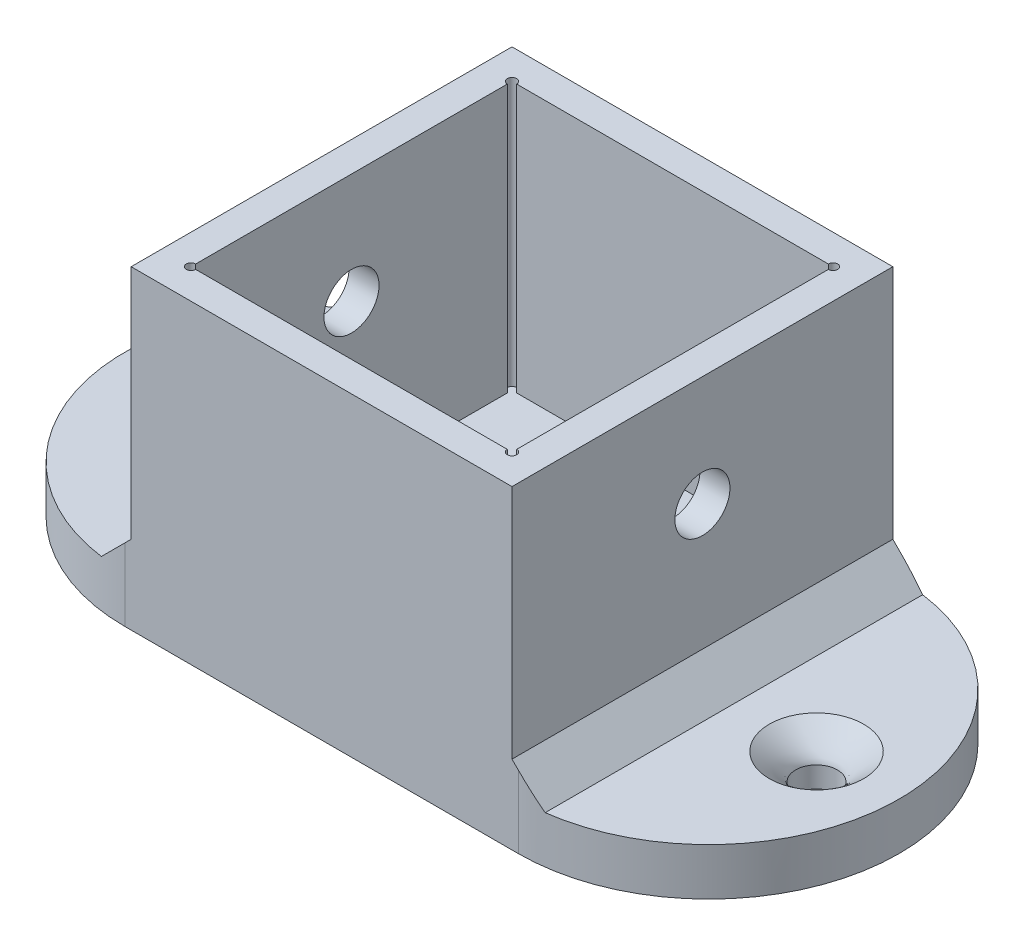
ISO-10303-21;
HEADER;
FILE_DESCRIPTION(('STEP AP214'),'2;1');
FILE_NAME('part.step','',(''),(''),'','','');
FILE_SCHEMA(('AUTOMOTIVE_DESIGN { 1 0 10303 214 1 1 1 1 }'));
ENDSEC;
DATA;
#1=APPLICATION_CONTEXT('core data for automotive mechanical design processes');
#2=APPLICATION_PROTOCOL_DEFINITION('international standard','automotive_design',2000,#1);
#3=PRODUCT_CONTEXT('',#1,'mechanical');
#4=PRODUCT('Part','Part','',(#3));
#5=PRODUCT_RELATED_PRODUCT_CATEGORY('part','',(#4));
#6=PRODUCT_DEFINITION_FORMATION('','',#4);
#7=PRODUCT_DEFINITION_CONTEXT('part definition',#1,'design');
#8=PRODUCT_DEFINITION('design','',#6,#7);
#9=PRODUCT_DEFINITION_SHAPE('','',#8);
#10=(LENGTH_UNIT() NAMED_UNIT(*) SI_UNIT(.MILLI.,.METRE.));
#11=(NAMED_UNIT(*) PLANE_ANGLE_UNIT() SI_UNIT($,.RADIAN.));
#12=(NAMED_UNIT(*) SI_UNIT($,.STERADIAN.) SOLID_ANGLE_UNIT());
#13=UNCERTAINTY_MEASURE_WITH_UNIT(LENGTH_MEASURE(1.E-05),#10,'distance_accuracy_value','');
#14=(GEOMETRIC_REPRESENTATION_CONTEXT(3) GLOBAL_UNCERTAINTY_ASSIGNED_CONTEXT((#13)) GLOBAL_UNIT_ASSIGNED_CONTEXT((#10,
#11,#12)) REPRESENTATION_CONTEXT('',''));
#15=CARTESIAN_POINT('',(0.,0.,0.));
#16=DIRECTION('',(0.,0.,1.));
#17=DIRECTION('',(1.,0.,0.));
#18=AXIS2_PLACEMENT_3D('',#15,#16,#17);
#19=CARTESIAN_POINT('',(-15.875,3.81,0.));
#20=DIRECTION('',(0.,1.,0.));
#21=DIRECTION('',(0.,0.,1.));
#22=AXIS2_PLACEMENT_3D('',#19,#20,#21);
#23=PLANE('',#22);
#24=CARTESIAN_POINT('',(24.5745,3.81,0.));
#25=DIRECTION('',(0.,-1.,0.));
#26=DIRECTION('',(0.,0.,1.));
#27=AXIS2_PLACEMENT_3D('',#24,#25,#26);
#28=CIRCLE('',#27,3.81);
#29=CARTESIAN_POINT('',(24.2111810717778,3.81,-3.79263751977373));
#30=VERTEX_POINT('',#29);
#31=EDGE_CURVE('E313',#30,#30,#28,.T.);
#32=ORIENTED_EDGE('',*,*,#31,.T.);
#33=EDGE_LOOP('',(#32));
#34=FACE_BOUND('',#33,.T.);
#35=CARTESIAN_POINT('',(15.875,3.81,0.));
#36=DIRECTION('',(0.,1.,0.));
#37=DIRECTION('',(0.,0.,1.));
#38=AXIS2_PLACEMENT_3D('',#35,#36,#37);
#39=CIRCLE('',#38,15.367);
#40=CARTESIAN_POINT('',(17.907,3.81,15.2320604318654));
#41=VERTEX_POINT('',#40);
#42=CARTESIAN_POINT('',(17.907,3.81,-15.2320604318654));
#43=VERTEX_POINT('',#42);
#44=EDGE_CURVE('E222',#41,#43,#39,.T.);
#45=ORIENTED_EDGE('',*,*,#44,.T.);
#46=DIRECTION('',(0.,0.,1.));
#47=VECTOR('',#46,1.);
#48=CARTESIAN_POINT('',(17.907,3.81,0.));
#49=LINE('',#48,#47);
#50=EDGE_CURVE('E248',#43,#41,#49,.T.);
#51=ORIENTED_EDGE('',*,*,#50,.T.);
#52=EDGE_LOOP('',(#45,#51));
#53=FACE_BOUND('',#52,.T.);
#54=ADVANCED_FACE('F37',(#34,#53),#23,.T.);
#55=CARTESIAN_POINT('',(-15.875,3.81,0.));
#56=DIRECTION('',(0.,-1.,0.));
#57=DIRECTION('',(0.,0.,-1.));
#58=AXIS2_PLACEMENT_3D('',#55,#56,#57);
#59=CYLINDRICAL_SURFACE('',#58,15.367);
#60=CARTESIAN_POINT('',(-15.875,0.,0.));
#61=DIRECTION('',(0.,1.,0.));
#62=DIRECTION('',(0.,0.,1.));
#63=AXIS2_PLACEMENT_3D('',#60,#61,#62);
#64=CIRCLE('',#63,15.367);
#65=CARTESIAN_POINT('',(-15.875,0.,-15.367));
#66=VERTEX_POINT('',#65);
#67=CARTESIAN_POINT('',(-15.875,0.,15.367));
#68=VERTEX_POINT('',#67);
#69=EDGE_CURVE('E218',#66,#68,#64,.T.);
#70=ORIENTED_EDGE('',*,*,#69,.T.);
#71=DIRECTION('',(0.,-1.,0.));
#72=VECTOR('',#71,1.);
#73=CARTESIAN_POINT('',(-15.875,3.81,15.367));
#74=LINE('',#73,#72);
#75=CARTESIAN_POINT('',(-15.875,5.84200000000002,15.367));
#76=VERTEX_POINT('',#75);
#77=EDGE_CURVE('E242',#76,#68,#74,.T.);
#78=ORIENTED_EDGE('',*,*,#77,.F.);
#79=CARTESIAN_POINT('',(-15.875,5.84200000000002,0.));
#80=DIRECTION('',(0.707106781186552,-0.707106781186543,0.));
#81=DIRECTION('',(-0.707106781186543,-0.707106781186552,0.));
#82=AXIS2_PLACEMENT_3D('',#79,#80,#81);
#83=ELLIPSE('',#82,21.7322198129875,15.367);
#84=CARTESIAN_POINT('',(-17.907,3.81,15.2320604318654));
#85=VERTEX_POINT('',#84);
#86=EDGE_CURVE('E268',#76,#85,#83,.T.);
#87=ORIENTED_EDGE('',*,*,#86,.T.);
#88=CARTESIAN_POINT('',(-15.875,3.81,0.));
#89=DIRECTION('',(0.,1.,0.));
#90=DIRECTION('',(0.,0.,1.));
#91=AXIS2_PLACEMENT_3D('',#88,#89,#90);
#92=CIRCLE('',#91,15.367);
#93=CARTESIAN_POINT('',(-17.907,3.81,-15.2320604318654));
#94=VERTEX_POINT('',#93);
#95=EDGE_CURVE('E219',#94,#85,#92,.T.);
#96=ORIENTED_EDGE('',*,*,#95,.F.);
#97=CARTESIAN_POINT('',(-15.875,5.84200000000002,0.));
#98=DIRECTION('',(0.707106781186552,-0.707106781186543,0.));
#99=DIRECTION('',(-0.707106781186543,-0.707106781186552,0.));
#100=AXIS2_PLACEMENT_3D('',#97,#98,#99);
#101=ELLIPSE('',#100,21.7322198129875,15.367);
#102=CARTESIAN_POINT('',(-15.875,5.84200000000002,-15.367));
#103=VERTEX_POINT('',#102);
#104=EDGE_CURVE('E46',#94,#103,#101,.T.);
#105=ORIENTED_EDGE('',*,*,#104,.T.);
#106=DIRECTION('',(0.,-1.,0.));
#107=VECTOR('',#106,1.);
#108=CARTESIAN_POINT('',(-15.875,3.81,-15.367));
#109=LINE('',#108,#107);
#110=EDGE_CURVE('E226',#103,#66,#109,.T.);
#111=ORIENTED_EDGE('',*,*,#110,.T.);
#112=EDGE_LOOP('',(#70,#78,#87,#96,#105,#111));
#113=FACE_BOUND('',#112,.T.);
#114=ADVANCED_FACE('F393',(#113),#59,.T.);
#115=CARTESIAN_POINT('',(-15.875,3.81,15.367));
#116=DIRECTION('',(0.,0.,-1.));
#117=DIRECTION('',(-1.,0.,0.));
#118=AXIS2_PLACEMENT_3D('',#115,#116,#117);
#119=PLANE('',#118);
#120=DIRECTION('',(1.,0.,0.));
#121=VECTOR('',#120,1.);
#122=CARTESIAN_POINT('',(-15.875,0.,15.367));
#123=LINE('',#122,#121);
#124=CARTESIAN_POINT('',(15.875,0.,15.367));
#125=VERTEX_POINT('',#124);
#126=EDGE_CURVE('E229',#68,#125,#123,.T.);
#127=ORIENTED_EDGE('',*,*,#126,.T.);
#128=DIRECTION('',(0.,-1.,0.));
#129=VECTOR('',#128,1.);
#130=CARTESIAN_POINT('',(15.875,3.81,15.367));
#131=LINE('',#130,#129);
#132=CARTESIAN_POINT('',(15.875,5.84200000000001,15.367));
#133=VERTEX_POINT('',#132);
#134=EDGE_CURVE('E239',#133,#125,#131,.T.);
#135=ORIENTED_EDGE('',*,*,#134,.F.);
#136=DIRECTION('',(-0.707106781186543,0.707106781186552,0.));
#137=VECTOR('',#136,1.);
#138=CARTESIAN_POINT('',(1.01600000000019,20.701,15.367));
#139=LINE('',#138,#137);
#140=CARTESIAN_POINT('',(15.367,6.35000000000002,15.367));
#141=VERTEX_POINT('',#140);
#142=EDGE_CURVE('E263',#133,#141,#139,.T.);
#143=ORIENTED_EDGE('',*,*,#142,.T.);
#144=DIRECTION('',(0.,-1.,0.));
#145=VECTOR('',#144,1.);
#146=CARTESIAN_POINT('',(15.367,25.4,15.367));
#147=LINE('',#146,#145);
#148=CARTESIAN_POINT('',(15.367,25.4,15.367));
#149=VERTEX_POINT('',#148);
#150=EDGE_CURVE('E206',#149,#141,#147,.T.);
#151=ORIENTED_EDGE('',*,*,#150,.F.);
#152=DIRECTION('',(1.,0.,0.));
#153=VECTOR('',#152,1.);
#154=CARTESIAN_POINT('',(-15.367,25.4,15.367));
#155=LINE('',#154,#153);
#156=CARTESIAN_POINT('',(-15.367,25.4,15.367));
#157=VERTEX_POINT('',#156);
#158=EDGE_CURVE('E204',#157,#149,#155,.T.);
#159=ORIENTED_EDGE('',*,*,#158,.F.);
#160=DIRECTION('',(0.,-1.,0.));
#161=VECTOR('',#160,1.);
#162=CARTESIAN_POINT('',(-15.367,25.4,15.367));
#163=LINE('',#162,#161);
#164=CARTESIAN_POINT('',(-15.367,6.35000000000002,15.367));
#165=VERTEX_POINT('',#164);
#166=EDGE_CURVE('E209',#157,#165,#163,.T.);
#167=ORIENTED_EDGE('',*,*,#166,.T.);
#168=DIRECTION('',(-0.707106781186543,-0.707106781186552,0.));
#169=VECTOR('',#168,1.);
#170=CARTESIAN_POINT('',(-16.891,4.826,15.367));
#171=LINE('',#170,#169);
#172=EDGE_CURVE('E265',#165,#76,#171,.T.);
#173=ORIENTED_EDGE('',*,*,#172,.T.);
#174=ORIENTED_EDGE('',*,*,#77,.T.);
#175=EDGE_LOOP('',(#127,#135,#143,#151,#159,#167,#173,#174));
#176=FACE_BOUND('',#175,.T.);
#177=ADVANCED_FACE('F397',(#176),#119,.F.);
#178=CARTESIAN_POINT('',(15.875,3.81,0.));
#179=DIRECTION('',(0.,-1.,0.));
#180=DIRECTION('',(0.,0.,-1.));
#181=AXIS2_PLACEMENT_3D('',#178,#179,#180);
#182=CYLINDRICAL_SURFACE('',#181,15.367);
#183=CARTESIAN_POINT('',(15.875,0.,0.));
#184=DIRECTION('',(0.,1.,0.));
#185=DIRECTION('',(0.,0.,1.));
#186=AXIS2_PLACEMENT_3D('',#183,#184,#185);
#187=CIRCLE('',#186,15.367);
#188=CARTESIAN_POINT('',(15.875,0.,-15.367));
#189=VERTEX_POINT('',#188);
#190=EDGE_CURVE('E231',#125,#189,#187,.T.);
#191=ORIENTED_EDGE('',*,*,#190,.T.);
#192=DIRECTION('',(0.,-1.,0.));
#193=VECTOR('',#192,1.);
#194=CARTESIAN_POINT('',(15.875,3.81,-15.367));
#195=LINE('',#194,#193);
#196=CARTESIAN_POINT('',(15.875,5.84200000000002,-15.367));
#197=VERTEX_POINT('',#196);
#198=EDGE_CURVE('E236',#197,#189,#195,.T.);
#199=ORIENTED_EDGE('',*,*,#198,.F.);
#200=CARTESIAN_POINT('',(15.875,5.84200000000001,0.));
#201=DIRECTION('',(-0.707106781186552,-0.707106781186543,0.));
#202=DIRECTION('',(0.707106781186543,-0.707106781186552,0.));
#203=AXIS2_PLACEMENT_3D('',#200,#201,#202);
#204=ELLIPSE('',#203,21.7322198129875,15.367);
#205=EDGE_CURVE('E258',#197,#43,#204,.T.);
#206=ORIENTED_EDGE('',*,*,#205,.T.);
#207=ORIENTED_EDGE('',*,*,#44,.F.);
#208=CARTESIAN_POINT('',(15.875,5.84200000000001,0.));
#209=DIRECTION('',(-0.707106781186552,-0.707106781186543,0.));
#210=DIRECTION('',(0.707106781186543,-0.707106781186552,0.));
#211=AXIS2_PLACEMENT_3D('',#208,#209,#210);
#212=ELLIPSE('',#211,21.7322198129875,15.367);
#213=EDGE_CURVE('E260',#41,#133,#212,.T.);
#214=ORIENTED_EDGE('',*,*,#213,.T.);
#215=ORIENTED_EDGE('',*,*,#134,.T.);
#216=EDGE_LOOP('',(#191,#199,#206,#207,#214,#215));
#217=FACE_BOUND('',#216,.T.);
#218=ADVANCED_FACE('F414',(#217),#182,.T.);
#219=CARTESIAN_POINT('',(-15.875,3.81,-15.367));
#220=DIRECTION('',(0.,0.,1.));
#221=DIRECTION('',(1.,0.,0.));
#222=AXIS2_PLACEMENT_3D('',#219,#220,#221);
#223=PLANE('',#222);
#224=DIRECTION('',(-1.,0.,0.));
#225=VECTOR('',#224,1.);
#226=CARTESIAN_POINT('',(-15.875,0.,-15.367));
#227=LINE('',#226,#225);
#228=EDGE_CURVE('E223',#189,#66,#227,.T.);
#229=ORIENTED_EDGE('',*,*,#228,.T.);
#230=ORIENTED_EDGE('',*,*,#110,.F.);
#231=DIRECTION('',(0.707106781186543,0.707106781186552,0.));
#232=VECTOR('',#231,1.);
#233=CARTESIAN_POINT('',(-16.891,4.826,-15.367));
#234=LINE('',#233,#232);
#235=CARTESIAN_POINT('',(-15.367,6.35000000000002,-15.367));
#236=VERTEX_POINT('',#235);
#237=EDGE_CURVE('E12',#103,#236,#234,.T.);
#238=ORIENTED_EDGE('',*,*,#237,.T.);
#239=DIRECTION('',(0.,-1.,0.));
#240=VECTOR('',#239,1.);
#241=CARTESIAN_POINT('',(-15.367,25.4,-15.367));
#242=LINE('',#241,#240);
#243=CARTESIAN_POINT('',(-15.367,25.4,-15.367));
#244=VERTEX_POINT('',#243);
#245=EDGE_CURVE('E212',#244,#236,#242,.T.);
#246=ORIENTED_EDGE('',*,*,#245,.F.);
#247=DIRECTION('',(-1.,0.,0.));
#248=VECTOR('',#247,1.);
#249=CARTESIAN_POINT('',(-15.367,25.4,-15.367));
#250=LINE('',#249,#248);
#251=CARTESIAN_POINT('',(15.367,25.4,-15.367));
#252=VERTEX_POINT('',#251);
#253=EDGE_CURVE('E199',#252,#244,#250,.T.);
#254=ORIENTED_EDGE('',*,*,#253,.F.);
#255=DIRECTION('',(0.,-1.,0.));
#256=VECTOR('',#255,1.);
#257=CARTESIAN_POINT('',(15.367,25.4,-15.367));
#258=LINE('',#257,#256);
#259=CARTESIAN_POINT('',(15.367,6.35000000000002,-15.367));
#260=VERTEX_POINT('',#259);
#261=EDGE_CURVE('E215',#252,#260,#258,.T.);
#262=ORIENTED_EDGE('',*,*,#261,.T.);
#263=DIRECTION('',(0.707106781186543,-0.707106781186552,0.));
#264=VECTOR('',#263,1.);
#265=CARTESIAN_POINT('',(1.01600000000019,20.701,-15.367));
#266=LINE('',#265,#264);
#267=EDGE_CURVE('E255',#260,#197,#266,.T.);
#268=ORIENTED_EDGE('',*,*,#267,.T.);
#269=ORIENTED_EDGE('',*,*,#198,.T.);
#270=EDGE_LOOP('',(#229,#230,#238,#246,#254,#262,#268,#269));
#271=FACE_BOUND('',#270,.T.);
#272=ADVANCED_FACE('F298',(#271),#223,.F.);
#273=CARTESIAN_POINT('',(-24.5745,3.81,0.));
#274=DIRECTION('',(0.,1.,0.));
#275=DIRECTION('',(0.,0.,1.));
#276=AXIS2_PLACEMENT_3D('',#273,#274,#275);
#277=CIRCLE('',#276,3.81);
#278=CARTESIAN_POINT('',(-24.2111810717778,3.81,-3.79263751977373));
#279=VERTEX_POINT('',#278);
#280=EDGE_CURVE('E276',#279,#279,#277,.T.);
#281=ORIENTED_EDGE('',*,*,#280,.F.);
#282=EDGE_LOOP('',(#281));
#283=FACE_BOUND('',#282,.T.);
#284=ORIENTED_EDGE('',*,*,#95,.T.);
#285=DIRECTION('',(0.,0.,-1.));
#286=VECTOR('',#285,1.);
#287=CARTESIAN_POINT('',(-17.907,3.81,0.));
#288=LINE('',#287,#286);
#289=EDGE_CURVE('E253',#85,#94,#288,.T.);
#290=ORIENTED_EDGE('',*,*,#289,.T.);
#291=EDGE_LOOP('',(#284,#290));
#292=FACE_BOUND('',#291,.T.);
#293=ADVANCED_FACE('F287',(#283,#292),#23,.T.);
#294=CARTESIAN_POINT('',(-15.875,0.,0.));
#295=DIRECTION('',(0.,1.,0.));
#296=DIRECTION('',(0.,0.,1.));
#297=AXIS2_PLACEMENT_3D('',#294,#295,#296);
#298=PLANE('',#297);
#299=CARTESIAN_POINT('',(24.5745,0.,0.));
#300=DIRECTION('',(0.,1.,0.));
#301=DIRECTION('',(0.,0.,1.));
#302=AXIS2_PLACEMENT_3D('',#299,#300,#301);
#303=CIRCLE('',#302,1.68274999999999);
#304=CARTESIAN_POINT('',(24.5745,0.,1.68274999999999));
#305=VERTEX_POINT('',#304);
#306=EDGE_CURVE('E275',#305,#305,#303,.F.);
#307=ORIENTED_EDGE('',*,*,#306,.F.);
#308=EDGE_LOOP('',(#307));
#309=FACE_BOUND('',#308,.T.);
#310=CARTESIAN_POINT('',(-24.5745,0.,0.));
#311=DIRECTION('',(0.,1.,0.));
#312=DIRECTION('',(0.,0.,1.));
#313=AXIS2_PLACEMENT_3D('',#310,#311,#312);
#314=CIRCLE('',#313,1.68275);
#315=CARTESIAN_POINT('',(-24.5745,0.,1.68275));
#316=VERTEX_POINT('',#315);
#317=EDGE_CURVE('E464',#316,#316,#314,.F.);
#318=ORIENTED_EDGE('',*,*,#317,.F.);
#319=EDGE_LOOP('',(#318));
#320=FACE_BOUND('',#319,.T.);
#321=ORIENTED_EDGE('',*,*,#69,.F.);
#322=ORIENTED_EDGE('',*,*,#228,.F.);
#323=ORIENTED_EDGE('',*,*,#190,.F.);
#324=ORIENTED_EDGE('',*,*,#126,.F.);
#325=EDGE_LOOP('',(#321,#322,#323,#324));
#326=FACE_BOUND('',#325,.T.);
#327=ADVANCED_FACE('F297',(#309,#320,#326),#298,.F.);
#328=CARTESIAN_POINT('',(0.,25.4,0.));
#329=DIRECTION('',(0.,-1.,0.));
#330=DIRECTION('',(0.,0.,-1.));
#331=AXIS2_PLACEMENT_3D('',#328,#329,#330);
#332=PLANE('',#331);
#333=DIRECTION('',(0.,0.,-1.));
#334=VECTOR('',#333,1.);
#335=CARTESIAN_POINT('',(15.367,25.4,15.367));
#336=LINE('',#335,#334);
#337=EDGE_CURVE('E196',#149,#252,#336,.T.);
#338=ORIENTED_EDGE('',*,*,#337,.T.);
#339=ORIENTED_EDGE('',*,*,#253,.T.);
#340=DIRECTION('',(0.,0.,1.));
#341=VECTOR('',#340,1.);
#342=CARTESIAN_POINT('',(-15.367,25.4,15.367));
#343=LINE('',#342,#341);
#344=EDGE_CURVE('E202',#244,#157,#343,.T.);
#345=ORIENTED_EDGE('',*,*,#344,.T.);
#346=ORIENTED_EDGE('',*,*,#158,.T.);
#347=EDGE_LOOP('',(#338,#339,#345,#346));
#348=FACE_BOUND('',#347,.T.);
#349=DIRECTION('',(-1.,0.,0.));
#350=VECTOR('',#349,1.);
#351=CARTESIAN_POINT('',(-12.954,25.4,-12.954));
#352=LINE('',#351,#350);
#353=CARTESIAN_POINT('',(12.573,25.4,-12.954));
#354=VERTEX_POINT('',#353);
#355=CARTESIAN_POINT('',(-12.573,25.4,-12.954));
#356=VERTEX_POINT('',#355);
#357=EDGE_CURVE('E450',#354,#356,#352,.T.);
#358=ORIENTED_EDGE('',*,*,#357,.F.);
#359=CARTESIAN_POINT('',(12.954,25.4,-12.954));
#360=DIRECTION('',(0.,1.,0.));
#361=DIRECTION('',(0.,0.,1.));
#362=AXIS2_PLACEMENT_3D('',#359,#360,#361);
#363=CIRCLE('',#362,0.381);
#364=CARTESIAN_POINT('',(12.954,25.4,-12.573));
#365=VERTEX_POINT('',#364);
#366=EDGE_CURVE('E452',#365,#354,#363,.T.);
#367=ORIENTED_EDGE('',*,*,#366,.F.);
#368=DIRECTION('',(0.,0.,-1.));
#369=VECTOR('',#368,1.);
#370=CARTESIAN_POINT('',(12.954,25.4,12.954));
#371=LINE('',#370,#369);
#372=CARTESIAN_POINT('',(12.954,25.4,12.573));
#373=VERTEX_POINT('',#372);
#374=EDGE_CURVE('E190',#373,#365,#371,.T.);
#375=ORIENTED_EDGE('',*,*,#374,.F.);
#376=CARTESIAN_POINT('',(12.954,25.4,12.954));
#377=DIRECTION('',(0.,1.,0.));
#378=DIRECTION('',(0.,0.,1.));
#379=AXIS2_PLACEMENT_3D('',#376,#377,#378);
#380=CIRCLE('',#379,0.381);
#381=CARTESIAN_POINT('',(12.573,25.4,12.954));
#382=VERTEX_POINT('',#381);
#383=EDGE_CURVE('E168',#382,#373,#380,.T.);
#384=ORIENTED_EDGE('',*,*,#383,.F.);
#385=DIRECTION('',(1.,0.,0.));
#386=VECTOR('',#385,1.);
#387=CARTESIAN_POINT('',(-12.954,25.4,12.954));
#388=LINE('',#387,#386);
#389=CARTESIAN_POINT('',(-12.573,25.4,12.954));
#390=VERTEX_POINT('',#389);
#391=EDGE_CURVE('E200',#390,#382,#388,.T.);
#392=ORIENTED_EDGE('',*,*,#391,.F.);
#393=CARTESIAN_POINT('',(-12.954,25.4,12.954));
#394=DIRECTION('',(0.,1.,0.));
#395=DIRECTION('',(0.,0.,1.));
#396=AXIS2_PLACEMENT_3D('',#393,#394,#395);
#397=CIRCLE('',#396,0.381);
#398=CARTESIAN_POINT('',(-12.954,25.4,12.573));
#399=VERTEX_POINT('',#398);
#400=EDGE_CURVE('E169',#399,#390,#397,.T.);
#401=ORIENTED_EDGE('',*,*,#400,.F.);
#402=DIRECTION('',(0.,0.,1.));
#403=VECTOR('',#402,1.);
#404=CARTESIAN_POINT('',(-12.954,25.4,12.954));
#405=LINE('',#404,#403);
#406=CARTESIAN_POINT('',(-12.954,25.4,-12.573));
#407=VERTEX_POINT('',#406);
#408=EDGE_CURVE('E179',#407,#399,#405,.T.);
#409=ORIENTED_EDGE('',*,*,#408,.F.);
#410=CARTESIAN_POINT('',(-12.954,25.4,-12.954));
#411=DIRECTION('',(0.,1.,0.));
#412=DIRECTION('',(0.,0.,1.));
#413=AXIS2_PLACEMENT_3D('',#410,#411,#412);
#414=CIRCLE('',#413,0.381);
#415=EDGE_CURVE('E454',#356,#407,#414,.T.);
#416=ORIENTED_EDGE('',*,*,#415,.F.);
#417=EDGE_LOOP('',(#358,#367,#375,#384,#392,#401,#409,#416));
#418=FACE_BOUND('',#417,.T.);
#419=ADVANCED_FACE('F381',(#348,#418),#332,.F.);
#420=CARTESIAN_POINT('',(15.367,25.4,15.367));
#421=DIRECTION('',(-1.,0.,0.));
#422=DIRECTION('',(0.,0.,1.));
#423=AXIS2_PLACEMENT_3D('',#420,#421,#422);
#424=PLANE('',#423);
#425=CARTESIAN_POINT('',(15.367,16.51,0.));
#426=DIRECTION('',(-1.,0.,0.));
#427=DIRECTION('',(0.,0.,1.));
#428=AXIS2_PLACEMENT_3D('',#425,#426,#427);
#429=CIRCLE('',#428,2.2225);
#430=CARTESIAN_POINT('',(15.367,16.51,2.2225));
#431=VERTEX_POINT('',#430);
#432=EDGE_CURVE('E317',#431,#431,#429,.T.);
#433=ORIENTED_EDGE('',*,*,#432,.T.);
#434=EDGE_LOOP('',(#433));
#435=FACE_BOUND('',#434,.T.);
#436=ORIENTED_EDGE('',*,*,#150,.T.);
#437=DIRECTION('',(0.,0.,-1.));
#438=VECTOR('',#437,1.);
#439=CARTESIAN_POINT('',(15.367,6.35000000000002,15.367));
#440=LINE('',#439,#438);
#441=EDGE_CURVE('E245',#141,#260,#440,.T.);
#442=ORIENTED_EDGE('',*,*,#441,.T.);
#443=ORIENTED_EDGE('',*,*,#261,.F.);
#444=ORIENTED_EDGE('',*,*,#337,.F.);
#445=EDGE_LOOP('',(#436,#442,#443,#444));
#446=FACE_BOUND('',#445,.T.);
#447=ADVANCED_FACE('F299',(#435,#446),#424,.F.);
#448=CARTESIAN_POINT('',(-15.367,25.4,15.367));
#449=DIRECTION('',(1.,0.,0.));
#450=DIRECTION('',(0.,0.,-1.));
#451=AXIS2_PLACEMENT_3D('',#448,#449,#450);
#452=PLANE('',#451);
#453=CARTESIAN_POINT('',(-15.367,16.51,0.));
#454=DIRECTION('',(1.,0.,0.));
#455=DIRECTION('',(0.,0.,-1.));
#456=AXIS2_PLACEMENT_3D('',#453,#454,#455);
#457=CIRCLE('',#456,2.2225);
#458=CARTESIAN_POINT('',(-15.367,16.51,-2.2225));
#459=VERTEX_POINT('',#458);
#460=EDGE_CURVE('E321',#459,#459,#457,.T.);
#461=ORIENTED_EDGE('',*,*,#460,.T.);
#462=EDGE_LOOP('',(#461));
#463=FACE_BOUND('',#462,.T.);
#464=ORIENTED_EDGE('',*,*,#245,.T.);
#465=DIRECTION('',(0.,0.,1.));
#466=VECTOR('',#465,1.);
#467=CARTESIAN_POINT('',(-15.367,6.35000000000002,15.367));
#468=LINE('',#467,#466);
#469=EDGE_CURVE('E250',#236,#165,#468,.T.);
#470=ORIENTED_EDGE('',*,*,#469,.T.);
#471=ORIENTED_EDGE('',*,*,#166,.F.);
#472=ORIENTED_EDGE('',*,*,#344,.F.);
#473=EDGE_LOOP('',(#464,#470,#471,#472));
#474=FACE_BOUND('',#473,.T.);
#475=ADVANCED_FACE('F379',(#463,#474),#452,.F.);
#476=CARTESIAN_POINT('',(12.954,25.4,12.954));
#477=DIRECTION('',(-1.,0.,0.));
#478=DIRECTION('',(0.,0.,1.));
#479=AXIS2_PLACEMENT_3D('',#476,#477,#478);
#480=PLANE('',#479);
#481=DIRECTION('',(0.,1.,0.));
#482=VECTOR('',#481,1.);
#483=CARTESIAN_POINT('',(12.954,2.73236926547171,-12.573));
#484=LINE('',#483,#482);
#485=CARTESIAN_POINT('',(12.954,3.81,-12.573));
#486=VERTEX_POINT('',#485);
#487=EDGE_CURVE('E661',#486,#365,#484,.T.);
#488=ORIENTED_EDGE('',*,*,#487,.F.);
#489=DIRECTION('',(0.,0.,-1.));
#490=VECTOR('',#489,1.);
#491=CARTESIAN_POINT('',(12.954,3.81,12.954));
#492=LINE('',#491,#490);
#493=CARTESIAN_POINT('',(12.954,3.81,12.573));
#494=VERTEX_POINT('',#493);
#495=EDGE_CURVE('E192',#494,#486,#492,.T.);
#496=ORIENTED_EDGE('',*,*,#495,.F.);
#497=DIRECTION('',(0.,1.,0.));
#498=VECTOR('',#497,1.);
#499=CARTESIAN_POINT('',(12.954,2.73236926547171,12.573));
#500=LINE('',#499,#498);
#501=EDGE_CURVE('E665',#373,#494,#500,.F.);
#502=ORIENTED_EDGE('',*,*,#501,.F.);
#503=ORIENTED_EDGE('',*,*,#374,.T.);
#504=EDGE_LOOP('',(#488,#496,#502,#503));
#505=FACE_BOUND('',#504,.T.);
#506=CARTESIAN_POINT('',(12.954,16.51,0.));
#507=DIRECTION('',(-1.,0.,0.));
#508=DIRECTION('',(0.,0.,1.));
#509=AXIS2_PLACEMENT_3D('',#506,#507,#508);
#510=CIRCLE('',#509,2.2225);
#511=CARTESIAN_POINT('',(12.954,16.51,2.2225));
#512=VERTEX_POINT('',#511);
#513=EDGE_CURVE('E674',#512,#512,#510,.T.);
#514=ORIENTED_EDGE('',*,*,#513,.F.);
#515=EDGE_LOOP('',(#514));
#516=FACE_BOUND('',#515,.T.);
#517=ADVANCED_FACE('F375',(#505,#516),#480,.T.);
#518=CARTESIAN_POINT('',(-12.954,25.4,-12.954));
#519=DIRECTION('',(0.,0.,1.));
#520=DIRECTION('',(1.,0.,0.));
#521=AXIS2_PLACEMENT_3D('',#518,#519,#520);
#522=PLANE('',#521);
#523=DIRECTION('',(0.,1.,0.));
#524=VECTOR('',#523,1.);
#525=CARTESIAN_POINT('',(12.573,2.73236926547171,-12.954));
#526=LINE('',#525,#524);
#527=CARTESIAN_POINT('',(12.573,3.81,-12.954));
#528=VERTEX_POINT('',#527);
#529=EDGE_CURVE('E662',#354,#528,#526,.F.);
#530=ORIENTED_EDGE('',*,*,#529,.F.);
#531=ORIENTED_EDGE('',*,*,#357,.T.);
#532=DIRECTION('',(0.,1.,0.));
#533=VECTOR('',#532,1.);
#534=CARTESIAN_POINT('',(-12.573,2.73236926547171,-12.954));
#535=LINE('',#534,#533);
#536=CARTESIAN_POINT('',(-12.573,3.81,-12.954));
#537=VERTEX_POINT('',#536);
#538=EDGE_CURVE('E672',#537,#356,#535,.T.);
#539=ORIENTED_EDGE('',*,*,#538,.F.);
#540=DIRECTION('',(-1.,0.,0.));
#541=VECTOR('',#540,1.);
#542=CARTESIAN_POINT('',(-12.954,3.81,-12.954));
#543=LINE('',#542,#541);
#544=EDGE_CURVE('E188',#528,#537,#543,.T.);
#545=ORIENTED_EDGE('',*,*,#544,.F.);
#546=EDGE_LOOP('',(#530,#531,#539,#545));
#547=FACE_BOUND('',#546,.T.);
#548=ADVANCED_FACE('F372',(#547),#522,.T.);
#549=CARTESIAN_POINT('',(-12.954,25.4,12.954));
#550=DIRECTION('',(1.,0.,0.));
#551=DIRECTION('',(0.,0.,-1.));
#552=AXIS2_PLACEMENT_3D('',#549,#550,#551);
#553=PLANE('',#552);
#554=DIRECTION('',(0.,1.,0.));
#555=VECTOR('',#554,1.);
#556=CARTESIAN_POINT('',(-12.954,2.73236926547171,12.573));
#557=LINE('',#556,#555);
#558=CARTESIAN_POINT('',(-12.954,3.81,12.573));
#559=VERTEX_POINT('',#558);
#560=EDGE_CURVE('E163',#559,#399,#557,.T.);
#561=ORIENTED_EDGE('',*,*,#560,.F.);
#562=DIRECTION('',(0.,0.,1.));
#563=VECTOR('',#562,1.);
#564=CARTESIAN_POINT('',(-12.954,3.81,12.954));
#565=LINE('',#564,#563);
#566=CARTESIAN_POINT('',(-12.954,3.81,-12.573));
#567=VERTEX_POINT('',#566);
#568=EDGE_CURVE('E177',#567,#559,#565,.T.);
#569=ORIENTED_EDGE('',*,*,#568,.F.);
#570=DIRECTION('',(0.,1.,0.));
#571=VECTOR('',#570,1.);
#572=CARTESIAN_POINT('',(-12.954,2.73236926547171,-12.573));
#573=LINE('',#572,#571);
#574=EDGE_CURVE('E670',#407,#567,#573,.F.);
#575=ORIENTED_EDGE('',*,*,#574,.F.);
#576=ORIENTED_EDGE('',*,*,#408,.T.);
#577=EDGE_LOOP('',(#561,#569,#575,#576));
#578=FACE_BOUND('',#577,.T.);
#579=CARTESIAN_POINT('',(-12.954,16.51,0.));
#580=DIRECTION('',(1.,0.,0.));
#581=DIRECTION('',(0.,0.,-1.));
#582=AXIS2_PLACEMENT_3D('',#579,#580,#581);
#583=CIRCLE('',#582,2.2225);
#584=CARTESIAN_POINT('',(-12.954,16.51,-2.2225));
#585=VERTEX_POINT('',#584);
#586=EDGE_CURVE('E41',#585,#585,#583,.T.);
#587=ORIENTED_EDGE('',*,*,#586,.F.);
#588=EDGE_LOOP('',(#587));
#589=FACE_BOUND('',#588,.T.);
#590=ADVANCED_FACE('F174',(#578,#589),#553,.T.);
#591=CARTESIAN_POINT('',(-12.954,25.4,12.954));
#592=DIRECTION('',(0.,0.,-1.));
#593=DIRECTION('',(-1.,0.,0.));
#594=AXIS2_PLACEMENT_3D('',#591,#592,#593);
#595=PLANE('',#594);
#596=DIRECTION('',(0.,1.,0.));
#597=VECTOR('',#596,1.);
#598=CARTESIAN_POINT('',(12.573,2.73236926547171,12.954));
#599=LINE('',#598,#597);
#600=CARTESIAN_POINT('',(12.573,3.81,12.954));
#601=VERTEX_POINT('',#600);
#602=EDGE_CURVE('E180',#601,#382,#599,.T.);
#603=ORIENTED_EDGE('',*,*,#602,.F.);
#604=DIRECTION('',(1.,0.,0.));
#605=VECTOR('',#604,1.);
#606=CARTESIAN_POINT('',(-12.954,3.81,12.954));
#607=LINE('',#606,#605);
#608=CARTESIAN_POINT('',(-12.573,3.81,12.954));
#609=VERTEX_POINT('',#608);
#610=EDGE_CURVE('E187',#609,#601,#607,.T.);
#611=ORIENTED_EDGE('',*,*,#610,.F.);
#612=DIRECTION('',(0.,1.,0.));
#613=VECTOR('',#612,1.);
#614=CARTESIAN_POINT('',(-12.573,2.73236926547171,12.954));
#615=LINE('',#614,#613);
#616=EDGE_CURVE('E166',#390,#609,#615,.F.);
#617=ORIENTED_EDGE('',*,*,#616,.F.);
#618=ORIENTED_EDGE('',*,*,#391,.T.);
#619=EDGE_LOOP('',(#603,#611,#617,#618));
#620=FACE_BOUND('',#619,.T.);
#621=ADVANCED_FACE('F366',(#620),#595,.T.);
#622=CARTESIAN_POINT('',(12.954,3.81,12.954));
#623=DIRECTION('',(0.,1.,0.));
#624=DIRECTION('',(0.,0.,1.));
#625=AXIS2_PLACEMENT_3D('',#622,#623,#624);
#626=CIRCLE('',#625,0.381);
#627=EDGE_CURVE('E690',#494,#601,#626,.F.);
#628=ORIENTED_EDGE('',*,*,#627,.F.);
#629=ORIENTED_EDGE('',*,*,#495,.T.);
#630=CARTESIAN_POINT('',(12.954,3.81,-12.954));
#631=DIRECTION('',(0.,1.,0.));
#632=DIRECTION('',(0.,0.,1.));
#633=AXIS2_PLACEMENT_3D('',#630,#631,#632);
#634=CIRCLE('',#633,0.381);
#635=EDGE_CURVE('E61',#528,#486,#634,.F.);
#636=ORIENTED_EDGE('',*,*,#635,.F.);
#637=ORIENTED_EDGE('',*,*,#544,.T.);
#638=CARTESIAN_POINT('',(-12.954,3.81,-12.954));
#639=DIRECTION('',(0.,1.,0.));
#640=DIRECTION('',(0.,0.,1.));
#641=AXIS2_PLACEMENT_3D('',#638,#639,#640);
#642=CIRCLE('',#641,0.381);
#643=EDGE_CURVE('E185',#567,#537,#642,.F.);
#644=ORIENTED_EDGE('',*,*,#643,.F.);
#645=ORIENTED_EDGE('',*,*,#568,.T.);
#646=CARTESIAN_POINT('',(-12.954,3.81,12.954));
#647=DIRECTION('',(0.,1.,0.));
#648=DIRECTION('',(0.,0.,1.));
#649=AXIS2_PLACEMENT_3D('',#646,#647,#648);
#650=CIRCLE('',#649,0.381);
#651=EDGE_CURVE('E54',#609,#559,#650,.F.);
#652=ORIENTED_EDGE('',*,*,#651,.F.);
#653=ORIENTED_EDGE('',*,*,#610,.T.);
#654=EDGE_LOOP('',(#628,#629,#636,#637,#644,#645,#652,#653));
#655=FACE_BOUND('',#654,.T.);
#656=ADVANCED_FACE('F183',(#655),#23,.T.);
#657=CARTESIAN_POINT('',(15.367,6.35000000000002,15.367));
#658=DIRECTION('',(-0.707106781186552,-0.707106781186543,0.));
#659=DIRECTION('',(0.,0.,-1.));
#660=AXIS2_PLACEMENT_3D('',#657,#658,#659);
#661=PLANE('',#660);
#662=ORIENTED_EDGE('',*,*,#213,.F.);
#663=ORIENTED_EDGE('',*,*,#50,.F.);
#664=ORIENTED_EDGE('',*,*,#205,.F.);
#665=ORIENTED_EDGE('',*,*,#267,.F.);
#666=ORIENTED_EDGE('',*,*,#441,.F.);
#667=ORIENTED_EDGE('',*,*,#142,.F.);
#668=EDGE_LOOP('',(#662,#663,#664,#665,#666,#667));
#669=FACE_BOUND('',#668,.T.);
#670=ADVANCED_FACE('F401',(#669),#661,.F.);
#671=CARTESIAN_POINT('',(-15.367,6.35000000000002,15.367));
#672=DIRECTION('',(0.707106781186552,-0.707106781186543,0.));
#673=DIRECTION('',(0.,0.,1.));
#674=AXIS2_PLACEMENT_3D('',#671,#672,#673);
#675=PLANE('',#674);
#676=ORIENTED_EDGE('',*,*,#104,.F.);
#677=ORIENTED_EDGE('',*,*,#289,.F.);
#678=ORIENTED_EDGE('',*,*,#86,.F.);
#679=ORIENTED_EDGE('',*,*,#172,.F.);
#680=ORIENTED_EDGE('',*,*,#469,.F.);
#681=ORIENTED_EDGE('',*,*,#237,.F.);
#682=EDGE_LOOP('',(#676,#677,#678,#679,#680,#681));
#683=FACE_BOUND('',#682,.T.);
#684=ADVANCED_FACE('F39',(#683),#675,.F.);
#685=CARTESIAN_POINT('',(-24.5745,-4.75953574416665,0.));
#686=DIRECTION('',(0.,1.,0.));
#687=DIRECTION('',(0.,0.,1.));
#688=AXIS2_PLACEMENT_3D('',#685,#686,#687);
#689=CYLINDRICAL_SURFACE('',#688,1.68275);
#690=ORIENTED_EDGE('',*,*,#317,.T.);
#691=EDGE_LOOP('',(#690));
#692=FACE_BOUND('',#691,.T.);
#693=CARTESIAN_POINT('',(-24.5745,1.67874723255667,0.));
#694=DIRECTION('',(0.,1.,0.));
#695=DIRECTION('',(0.,0.,1.));
#696=AXIS2_PLACEMENT_3D('',#693,#694,#695);
#697=CIRCLE('',#696,1.68275);
#698=CARTESIAN_POINT('',(-25.8346301805424,1.67874723255667,-1.11522172261224));
#699=VERTEX_POINT('',#698);
#700=EDGE_CURVE('E272',#699,#699,#697,.T.);
#701=ORIENTED_EDGE('',*,*,#700,.T.);
#702=EDGE_LOOP('',(#701));
#703=FACE_BOUND('',#702,.T.);
#704=ADVANCED_FACE('F361',(#692,#703),#689,.F.);
#705=CARTESIAN_POINT('',(24.5745,-4.75953574416665,0.));
#706=DIRECTION('',(0.,1.,0.));
#707=DIRECTION('',(0.,0.,1.));
#708=AXIS2_PLACEMENT_3D('',#705,#706,#707);
#709=CYLINDRICAL_SURFACE('',#708,1.68274999999999);
#710=ORIENTED_EDGE('',*,*,#306,.T.);
#711=EDGE_LOOP('',(#710));
#712=FACE_BOUND('',#711,.T.);
#713=CARTESIAN_POINT('',(24.5745,1.6787472325566,0.));
#714=DIRECTION('',(0.,-1.,0.));
#715=DIRECTION('',(0.,0.,-1.));
#716=AXIS2_PLACEMENT_3D('',#713,#714,#715);
#717=CIRCLE('',#716,1.68274999999999);
#718=CARTESIAN_POINT('',(25.8346301805424,1.6787472325566,-1.11522172261216));
#719=VERTEX_POINT('',#718);
#720=EDGE_CURVE('E285',#719,#719,#717,.F.);
#721=ORIENTED_EDGE('',*,*,#720,.T.);
#722=EDGE_LOOP('',(#721));
#723=FACE_BOUND('',#722,.T.);
#724=ADVANCED_FACE('F349',(#712,#723),#709,.F.);
#725=CARTESIAN_POINT('',(-26.1459871160222,1.27,-0.601727352441352));
#726=CARTESIAN_POINT('',(-24.2111810717778,3.81,-3.79263751977373));
#727=CARTESIAN_POINT('',(-27.3494418209049,1.27,2.54124687960314));
#728=CARTESIAN_POINT('',(-31.7964561113252,3.81,-4.51927537621817));
#729=CARTESIAN_POINT('',(-24.2064675888604,1.27,3.74470158448585));
#730=CARTESIAN_POINT('',(-32.5230939677697,3.81,3.0659996633293));
#731=CARTESIAN_POINT('',(-23.0030128839777,1.27,0.601727352441352));
#732=CARTESIAN_POINT('',(-24.9378189282222,3.81,3.79263751977374));
#733=CARTESIAN_POINT('',(-21.799558179095,1.27,-2.54124687960314));
#734=CARTESIAN_POINT('',(-17.3525438886747,3.81,4.51927537621817));
#735=CARTESIAN_POINT('',(-24.9425324111395,1.27,-3.74470158448584));
#736=CARTESIAN_POINT('',(-16.6259060322303,3.81,-3.0659996633293));
#737=CARTESIAN_POINT('',(-26.1459871160222,1.27,-0.601727352441352));
#738=CARTESIAN_POINT('',(-24.2111810717778,3.81,-3.79263751977373));
#739=(BOUNDED_SURFACE() B_SPLINE_SURFACE(3,1,((#725,#726),(#727,#728),(#729,#730),(#731,#732),
(#733,#734),(#735,#736),(#737,#738)),.UNSPECIFIED.,.T.,.F.,.F.) B_SPLINE_SURFACE_WITH_KNOTS((4,
3,4),(2,2),(0.,0.5,1.),(0.,1.),
.UNSPECIFIED.) GEOMETRIC_REPRESENTATION_ITEM() RATIONAL_B_SPLINE_SURFACE(((1.,1.),
(0.333333333333333,0.333333333333333),(0.333333333333333,0.333333333333333),(1.,1.),
(0.333333333333333,0.333333333333333),(0.333333333333333,0.333333333333333),(1.,1.))) REPRESENTATION_ITEM('') SURFACE());
#740=CARTESIAN_POINT('',(-24.2111810717778,3.81,-3.79263751977373));
#741=CARTESIAN_POINT('',(-24.2280919999941,3.78779945033913,-3.76474777188663));
#742=CARTESIAN_POINT('',(-24.2450029282104,3.76559890067826,-3.73685802399954));
#743=CARTESIAN_POINT('',(-24.278824784643,3.72119780135653,-3.68107852822534));
#744=CARTESIAN_POINT('',(-24.2957357128593,3.69899725169566,-3.65318878033824));
#745=CARTESIAN_POINT('',(-24.3295575692919,3.65459615237392,-3.59740928456404));
#746=CARTESIAN_POINT('',(-24.3464684975082,3.63239560271306,-3.56951953667694));
#747=CARTESIAN_POINT('',(-24.3802903539408,3.58799450339132,-3.51374004090274));
#748=CARTESIAN_POINT('',(-24.3972012821571,3.56579395373045,-3.48585029301565));
#749=CARTESIAN_POINT('',(-24.4310231385897,3.52139285440871,-3.43007079724145));
#750=CARTESIAN_POINT('',(-24.4479340668059,3.49919230474785,-3.40218104935435));
#751=CARTESIAN_POINT('',(-24.4817559232385,3.45479120542611,-3.34640155358015));
#752=CARTESIAN_POINT('',(-24.4986668514548,3.43259065576524,-3.31851180569305));
#753=CARTESIAN_POINT('',(-24.5324887078874,3.38818955644351,-3.26273230991885));
#754=CARTESIAN_POINT('',(-24.5493996361037,3.36598900678264,-3.23484256203175));
#755=CARTESIAN_POINT('',(-24.5832214925363,3.3215879074609,-3.17906306625756));
#756=CARTESIAN_POINT('',(-24.6001324207526,3.29938735780003,-3.15117331837046));
#757=CARTESIAN_POINT('',(-24.6339542771852,3.2549862584783,-3.09539382259626));
#758=CARTESIAN_POINT('',(-24.6508652054015,3.23278570881743,-3.06750407470916));
#759=CARTESIAN_POINT('',(-24.6846870618341,3.18838460949569,-3.01172457893496));
#760=CARTESIAN_POINT('',(-24.7015979900504,3.16618405983483,-2.98383483104786));
#761=CARTESIAN_POINT('',(-24.735419846483,3.12178296051309,-2.92805533527367));
#762=CARTESIAN_POINT('',(-24.7523307746993,3.09958241085222,-2.90016558738657));
#763=CARTESIAN_POINT('',(-24.7861526311319,3.05518131153049,-2.84438609161237));
#764=CARTESIAN_POINT('',(-24.8030635593482,3.03298076186962,-2.81649634372527));
#765=CARTESIAN_POINT('',(-24.8368854157808,2.98857966254788,-2.76071684795107));
#766=CARTESIAN_POINT('',(-24.8537963439971,2.96637911288701,-2.73282710006397));
#767=CARTESIAN_POINT('',(-24.8876182004297,2.92197801356528,-2.67704760428978));
#768=CARTESIAN_POINT('',(-24.904529128646,2.89977746390441,-2.64915785640268));
#769=CARTESIAN_POINT('',(-24.9383509850786,2.85537636458267,-2.59337836062848));
#770=CARTESIAN_POINT('',(-24.9552619132949,2.83317581492181,-2.56548861274138));
#771=CARTESIAN_POINT('',(-24.9890837697275,2.78877471560007,-2.50970911696718));
#772=CARTESIAN_POINT('',(-25.0059946979438,2.7665741659392,-2.48181936908008));
#773=CARTESIAN_POINT('',(-25.0398165543764,2.72217306661747,-2.42603987330589));
#774=CARTESIAN_POINT('',(-25.0567274825927,2.6999725169566,-2.39815012541879));
#775=CARTESIAN_POINT('',(-25.0905493390253,2.65557141763486,-2.34237062964459));
#776=CARTESIAN_POINT('',(-25.1074602672416,2.63337086797399,-2.31448088175749));
#777=CARTESIAN_POINT('',(-25.1412821236742,2.58896976865226,-2.25870138598329));
#778=CARTESIAN_POINT('',(-25.1581930518905,2.56676921899139,-2.23081163809619));
#779=CARTESIAN_POINT('',(-25.1920149083231,2.52236811966965,-2.175032142322));
#780=CARTESIAN_POINT('',(-25.2089258365394,2.50016757000879,-2.1471423944349));
#781=CARTESIAN_POINT('',(-25.242747692972,2.45576647068705,-2.0913628986607));
#782=CARTESIAN_POINT('',(-25.2596586211883,2.43356592102618,-2.0634731507736));
#783=CARTESIAN_POINT('',(-25.2934804776208,2.38916482170444,-2.0076936549994));
#784=CARTESIAN_POINT('',(-25.3103914058371,2.36696427204358,-1.9798039071123));
#785=CARTESIAN_POINT('',(-25.3442132622697,2.32256317272184,-1.9240244113381));
#786=CARTESIAN_POINT('',(-25.361124190486,2.30036262306097,-1.89613466345101));
#787=CARTESIAN_POINT('',(-25.3949460469186,2.25596152373924,-1.84035516767681));
#788=CARTESIAN_POINT('',(-25.4118569751349,2.23376097407837,-1.81246541978971));
#789=CARTESIAN_POINT('',(-25.4456788315675,2.18935987475663,-1.75668592401551));
#790=CARTESIAN_POINT('',(-25.4625897597838,2.16715932509576,-1.72879617612841));
#791=CARTESIAN_POINT('',(-25.4964116162164,2.12275822577403,-1.67301668035422));
#792=CARTESIAN_POINT('',(-25.5133225444327,2.10055767611316,-1.64512693246712));
#793=CARTESIAN_POINT('',(-25.5471444008653,2.05615657679142,-1.58934743669292));
#794=CARTESIAN_POINT('',(-25.5640553290816,2.03395602713056,-1.56145768880582));
#795=CARTESIAN_POINT('',(-25.5978771855142,1.98955492780882,-1.50567819303162));
#796=CARTESIAN_POINT('',(-25.6147881137305,1.96735437814795,-1.47778844514452));
#797=CARTESIAN_POINT('',(-25.6486099701631,1.92295327882622,-1.42200894937032));
#798=CARTESIAN_POINT('',(-25.6655208983794,1.90075272916535,-1.39411920148323));
#799=CARTESIAN_POINT('',(-25.699342754812,1.85635162984361,-1.33833970570903));
#800=CARTESIAN_POINT('',(-25.7162536830283,1.83415108018274,-1.31044995782193));
#801=CARTESIAN_POINT('',(-25.7500755394609,1.78974998086101,-1.25467046204773));
#802=CARTESIAN_POINT('',(-25.7669864676772,1.76754943120014,-1.22678071416063));
#803=CARTESIAN_POINT('',(-25.8008083241098,1.7231483318784,-1.17100121838643));
#804=CARTESIAN_POINT('',(-25.8177192523261,1.70094778221754,-1.14311147049933));
#805=CARTESIAN_POINT('',(-25.8346301805424,1.67874723255667,-1.11522172261224));
#806=B_SPLINE_CURVE_WITH_KNOTS('',3,(#740,#741,#742,#743,#744,#745,#746,#747,#748,#749,#750,
#751,#752,#753,#754,#755,#756,#757,#758,#759,#760,#761,#762,#763,#764,#765,#766,#767,#768,#769,
#770,#771,#772,#773,#774,#775,#776,#777,#778,#779,#780,#781,#782,#783,#784,#785,#786,#787,#788,
#789,#790,#791,#792,#793,#794,#795,#796,#797,#798,#799,#800,#801,#802,#803,#804,#805),
.UNSPECIFIED.,.F.,.F.,(4,2,2,2,2,2,2,2,2,2,2,2,2,2,2,2,2,2,2,2,2,2,2,2,2,2,2,2,2,2,2,2,4),(0.,
0.118364426329393,0.236728852658788,0.355093278988181,0.473457705317575,0.591822131646971,
0.710186557976364,0.828550984305758,0.946915410635152,1.06527983696454,1.18364426329394,
1.30200868962333,1.42037311595273,1.53873754228212,1.65710196861152,1.77546639494091,
1.8938308212703,2.0121952475997,2.13055967392909,2.24892410025849,2.36728852658788,
2.48565295291727,2.60401737924666,2.72238180557606,2.84074623190545,2.95911065823485,
3.07747508456424,3.19583951089363,3.31420393722303,3.43256836355242,3.55093278988182,
3.66929721621121,3.7876616425406),.UNSPECIFIED.);
#807=EDGE_CURVE('BSEAM337',#279,#699,#806,.T.);
#808=ORIENTED_EDGE('',*,*,#280,.T.);
#809=ORIENTED_EDGE('',*,*,#700,.F.);
#810=ORIENTED_EDGE('',*,*,#807,.T.);
#811=ORIENTED_EDGE('',*,*,#807,.F.);
#812=EDGE_LOOP('',(#808,#810,#809,#811));
#813=FACE_BOUND('',#812,.T.);
#814=ADVANCED_FACE('F337',(#813),#739,.F.);
#815=CARTESIAN_POINT('',(26.1459871160222,1.27,-0.601727352441352));
#816=CARTESIAN_POINT('',(24.2111810717778,3.81,-3.79263751977373));
#817=CARTESIAN_POINT('',(27.3494418209049,1.27,2.54124687960314));
#818=CARTESIAN_POINT('',(31.7964561113252,3.81,-4.51927537621817));
#819=CARTESIAN_POINT('',(24.2064675888604,1.27,3.74470158448585));
#820=CARTESIAN_POINT('',(32.5230939677697,3.81,3.0659996633293));
#821=CARTESIAN_POINT('',(23.0030128839777,1.27,0.601727352441352));
#822=CARTESIAN_POINT('',(24.9378189282222,3.81,3.79263751977374));
#823=CARTESIAN_POINT('',(21.799558179095,1.27,-2.54124687960314));
#824=CARTESIAN_POINT('',(17.3525438886747,3.81,4.51927537621817));
#825=CARTESIAN_POINT('',(24.9425324111395,1.27,-3.74470158448584));
#826=CARTESIAN_POINT('',(16.6259060322303,3.81,-3.0659996633293));
#827=CARTESIAN_POINT('',(26.1459871160222,1.27,-0.601727352441352));
#828=CARTESIAN_POINT('',(24.2111810717778,3.81,-3.79263751977373));
#829=(BOUNDED_SURFACE() B_SPLINE_SURFACE(3,1,((#815,#816),(#817,#818),(#819,#820),(#821,#822),
(#823,#824),(#825,#826),(#827,#828)),.UNSPECIFIED.,.T.,.F.,.F.) B_SPLINE_SURFACE_WITH_KNOTS((4,
3,4),(2,2),(0.,0.5,1.),(0.,1.),
.UNSPECIFIED.) GEOMETRIC_REPRESENTATION_ITEM() RATIONAL_B_SPLINE_SURFACE(((1.,1.),
(0.333333333333333,0.333333333333333),(0.333333333333333,0.333333333333333),(1.,1.),
(0.333333333333333,0.333333333333333),(0.333333333333333,0.333333333333333),(1.,1.))) REPRESENTATION_ITEM('') SURFACE());
#830=CARTESIAN_POINT('',(24.2111810717778,3.81,-3.79263751977373));
#831=CARTESIAN_POINT('',(24.2280919999941,3.78779945033913,-3.76474777188663));
#832=CARTESIAN_POINT('',(24.2450029282104,3.76559890067826,-3.73685802399953));
#833=CARTESIAN_POINT('',(24.278824784643,3.72119780135652,-3.68107852822533));
#834=CARTESIAN_POINT('',(24.2957357128593,3.69899725169566,-3.65318878033823));
#835=CARTESIAN_POINT('',(24.3295575692919,3.65459615237392,-3.59740928456403));
#836=CARTESIAN_POINT('',(24.3464684975082,3.63239560271305,-3.56951953667694));
#837=CARTESIAN_POINT('',(24.3802903539408,3.58799450339131,-3.51374004090274));
#838=CARTESIAN_POINT('',(24.3972012821571,3.56579395373044,-3.48585029301564));
#839=CARTESIAN_POINT('',(24.4310231385897,3.52139285440871,-3.43007079724144));
#840=CARTESIAN_POINT('',(24.447934066806,3.49919230474784,-3.40218104935434));
#841=CARTESIAN_POINT('',(24.4817559232385,3.4547912054261,-3.34640155358014));
#842=CARTESIAN_POINT('',(24.4986668514548,3.43259065576523,-3.31851180569304));
#843=CARTESIAN_POINT('',(24.5324887078875,3.38818955644349,-3.26273230991884));
#844=CARTESIAN_POINT('',(24.5493996361038,3.36598900678263,-3.23484256203174));
#845=CARTESIAN_POINT('',(24.5832214925363,3.32158790746089,-3.17906306625754));
#846=CARTESIAN_POINT('',(24.6001324207526,3.29938735780002,-3.15117331837044));
#847=CARTESIAN_POINT('',(24.6339542771852,3.25498625847828,-3.09539382259624));
#848=CARTESIAN_POINT('',(24.6508652054015,3.23278570881741,-3.06750407470914));
#849=CARTESIAN_POINT('',(24.6846870618341,3.18838460949568,-3.01172457893494));
#850=CARTESIAN_POINT('',(24.7015979900504,3.16618405983481,-2.98383483104784));
#851=CARTESIAN_POINT('',(24.735419846483,3.12178296051307,-2.92805533527364));
#852=CARTESIAN_POINT('',(24.7523307746993,3.0995824108522,-2.90016558738654));
#853=CARTESIAN_POINT('',(24.7861526311319,3.05518131153046,-2.84438609161234));
#854=CARTESIAN_POINT('',(24.8030635593482,3.0329807618696,-2.81649634372524));
#855=CARTESIAN_POINT('',(24.8368854157808,2.98857966254786,-2.76071684795104));
#856=CARTESIAN_POINT('',(24.8537963439971,2.96637911288699,-2.73282710006394));
#857=CARTESIAN_POINT('',(24.8876182004297,2.92197801356525,-2.67704760428974));
#858=CARTESIAN_POINT('',(24.904529128646,2.89977746390438,-2.64915785640264));
#859=CARTESIAN_POINT('',(24.9383509850786,2.85537636458265,-2.59337836062844));
#860=CARTESIAN_POINT('',(24.9552619132949,2.83317581492178,-2.56548861274134));
#861=CARTESIAN_POINT('',(24.9890837697275,2.78877471560004,-2.50970911696714));
#862=CARTESIAN_POINT('',(25.0059946979438,2.76657416593917,-2.48181936908004));
#863=CARTESIAN_POINT('',(25.0398165543764,2.72217306661743,-2.42603987330585));
#864=CARTESIAN_POINT('',(25.0567274825927,2.69997251695656,-2.39815012541875));
#865=CARTESIAN_POINT('',(25.0905493390253,2.65557141763483,-2.34237062964455));
#866=CARTESIAN_POINT('',(25.1074602672416,2.63337086797396,-2.31448088175745));
#867=CARTESIAN_POINT('',(25.1412821236742,2.58896976865222,-2.25870138598325));
#868=CARTESIAN_POINT('',(25.1581930518905,2.56676921899135,-2.23081163809615));
#869=CARTESIAN_POINT('',(25.1920149083231,2.52236811966961,-2.17503214232195));
#870=CARTESIAN_POINT('',(25.2089258365394,2.50016757000875,-2.14714239443485));
#871=CARTESIAN_POINT('',(25.242747692972,2.45576647068701,-2.09136289866065));
#872=CARTESIAN_POINT('',(25.2596586211883,2.43356592102614,-2.06347315077355));
#873=CARTESIAN_POINT('',(25.2934804776209,2.3891648217044,-2.00769365499935));
#874=CARTESIAN_POINT('',(25.3103914058372,2.36696427204353,-1.97980390711225));
#875=CARTESIAN_POINT('',(25.3442132622698,2.3225631727218,-1.92402441133805));
#876=CARTESIAN_POINT('',(25.3611241904861,2.30036262306093,-1.89613466345095));
#877=CARTESIAN_POINT('',(25.3949460469187,2.25596152373919,-1.84035516767675));
#878=CARTESIAN_POINT('',(25.411856975135,2.23376097407832,-1.81246541978965));
#879=CARTESIAN_POINT('',(25.4456788315676,2.18935987475658,-1.75668592401545));
#880=CARTESIAN_POINT('',(25.4625897597839,2.16715932509572,-1.72879617612835));
#881=CARTESIAN_POINT('',(25.4964116162165,2.12275822577398,-1.67301668035415));
#882=CARTESIAN_POINT('',(25.5133225444328,2.10055767611311,-1.64512693246705));
#883=CARTESIAN_POINT('',(25.5471444008654,2.05615657679137,-1.58934743669285));
#884=CARTESIAN_POINT('',(25.5640553290817,2.0339560271305,-1.56145768880575));
#885=CARTESIAN_POINT('',(25.5978771855142,1.98955492780877,-1.50567819303155));
#886=CARTESIAN_POINT('',(25.6147881137306,1.9673543781479,-1.47778844514445));
#887=CARTESIAN_POINT('',(25.6486099701631,1.92295327882616,-1.42200894937025));
#888=CARTESIAN_POINT('',(25.6655208983794,1.90075272916529,-1.39411920148315));
#889=CARTESIAN_POINT('',(25.699342754812,1.85635162984355,-1.33833970570895));
#890=CARTESIAN_POINT('',(25.7162536830283,1.83415108018269,-1.31044995782185));
#891=CARTESIAN_POINT('',(25.7500755394609,1.78974998086095,-1.25467046204766));
#892=CARTESIAN_POINT('',(25.7669864676772,1.76754943120008,-1.22678071416056));
#893=CARTESIAN_POINT('',(25.8008083241098,1.72314833187834,-1.17100121838636));
#894=CARTESIAN_POINT('',(25.8177192523261,1.70094778221747,-1.14311147049926));
#895=CARTESIAN_POINT('',(25.8346301805424,1.6787472325566,-1.11522172261216));
#896=B_SPLINE_CURVE_WITH_KNOTS('',3,(#830,#831,#832,#833,#834,#835,#836,#837,#838,#839,#840,
#841,#842,#843,#844,#845,#846,#847,#848,#849,#850,#851,#852,#853,#854,#855,#856,#857,#858,#859,
#860,#861,#862,#863,#864,#865,#866,#867,#868,#869,#870,#871,#872,#873,#874,#875,#876,#877,#878,
#879,#880,#881,#882,#883,#884,#885,#886,#887,#888,#889,#890,#891,#892,#893,#894,#895),
.UNSPECIFIED.,.F.,.F.,(4,2,2,2,2,2,2,2,2,2,2,2,2,2,2,2,2,2,2,2,2,2,2,2,2,2,2,2,2,2,2,2,4),(0.,
0.118364426329398,0.236728852658793,0.355093278988193,0.47345770531759,0.591822131646987,
0.710186557976385,0.828550984305782,0.946915410635181,1.06527983696458,1.18364426329397,
1.30200868962337,1.42037311595277,1.53873754228217,1.65710196861156,1.77546639494096,
1.89383082127036,2.01219524759976,2.13055967392915,2.24892410025855,2.36728852658795,
2.48565295291735,2.60401737924674,2.72238180557614,2.84074623190554,2.95911065823493,
3.07747508456433,3.19583951089373,3.31420393722313,3.43256836355252,3.55093278988192,
3.66929721621132,3.78766164254072),.UNSPECIFIED.);
#897=EDGE_CURVE('BSEAM348',#30,#719,#896,.T.);
#898=ORIENTED_EDGE('',*,*,#31,.F.);
#899=ORIENTED_EDGE('',*,*,#720,.F.);
#900=ORIENTED_EDGE('',*,*,#897,.T.);
#901=ORIENTED_EDGE('',*,*,#897,.F.);
#902=EDGE_LOOP('',(#898,#900,#899,#901));
#903=FACE_BOUND('',#902,.T.);
#904=ADVANCED_FACE('F348',(#903),#829,.T.);
#905=CARTESIAN_POINT('',(31.242,16.51,0.));
#906=DIRECTION('',(-1.,0.,0.));
#907=DIRECTION('',(0.,0.,1.));
#908=AXIS2_PLACEMENT_3D('',#905,#906,#907);
#909=CYLINDRICAL_SURFACE('',#908,2.2225);
#910=ORIENTED_EDGE('',*,*,#586,.T.);
#911=EDGE_LOOP('',(#910));
#912=FACE_BOUND('',#911,.T.);
#913=ORIENTED_EDGE('',*,*,#460,.F.);
#914=EDGE_LOOP('',(#913));
#915=FACE_BOUND('',#914,.T.);
#916=ADVANCED_FACE('F506',(#912,#915),#909,.F.);
#917=ORIENTED_EDGE('',*,*,#513,.T.);
#918=EDGE_LOOP('',(#917));
#919=FACE_BOUND('',#918,.T.);
#920=ORIENTED_EDGE('',*,*,#432,.F.);
#921=EDGE_LOOP('',(#920));
#922=FACE_BOUND('',#921,.T.);
#923=ADVANCED_FACE('F510',(#919,#922),#909,.F.);
#924=CARTESIAN_POINT('',(-12.954,2.73236926547171,-12.954));
#925=DIRECTION('',(0.,1.,0.));
#926=DIRECTION('',(0.,0.,1.));
#927=AXIS2_PLACEMENT_3D('',#924,#925,#926);
#928=CYLINDRICAL_SURFACE('',#927,0.381);
#929=ORIENTED_EDGE('',*,*,#538,.T.);
#930=ORIENTED_EDGE('',*,*,#415,.T.);
#931=ORIENTED_EDGE('',*,*,#574,.T.);
#932=ORIENTED_EDGE('',*,*,#643,.T.);
#933=EDGE_LOOP('',(#929,#930,#931,#932));
#934=FACE_BOUND('',#933,.T.);
#935=ADVANCED_FACE('F518',(#934),#928,.F.);
#936=CARTESIAN_POINT('',(-12.954,2.73236926547171,12.954));
#937=DIRECTION('',(0.,1.,0.));
#938=DIRECTION('',(0.,0.,1.));
#939=AXIS2_PLACEMENT_3D('',#936,#937,#938);
#940=CYLINDRICAL_SURFACE('',#939,0.381);
#941=ORIENTED_EDGE('',*,*,#560,.T.);
#942=ORIENTED_EDGE('',*,*,#400,.T.);
#943=ORIENTED_EDGE('',*,*,#616,.T.);
#944=ORIENTED_EDGE('',*,*,#651,.T.);
#945=EDGE_LOOP('',(#941,#942,#943,#944));
#946=FACE_BOUND('',#945,.T.);
#947=ADVANCED_FACE('F162',(#946),#940,.F.);
#948=CARTESIAN_POINT('',(12.954,2.73236926547171,12.954));
#949=DIRECTION('',(0.,1.,0.));
#950=DIRECTION('',(0.,0.,1.));
#951=AXIS2_PLACEMENT_3D('',#948,#949,#950);
#952=CYLINDRICAL_SURFACE('',#951,0.381);
#953=ORIENTED_EDGE('',*,*,#501,.T.);
#954=ORIENTED_EDGE('',*,*,#627,.T.);
#955=ORIENTED_EDGE('',*,*,#602,.T.);
#956=ORIENTED_EDGE('',*,*,#383,.T.);
#957=EDGE_LOOP('',(#953,#954,#955,#956));
#958=FACE_BOUND('',#957,.T.);
#959=ADVANCED_FACE('F535',(#958),#952,.F.);
#960=CARTESIAN_POINT('',(12.954,2.73236926547171,-12.954));
#961=DIRECTION('',(0.,1.,0.));
#962=DIRECTION('',(0.,0.,1.));
#963=AXIS2_PLACEMENT_3D('',#960,#961,#962);
#964=CYLINDRICAL_SURFACE('',#963,0.381);
#965=ORIENTED_EDGE('',*,*,#487,.T.);
#966=ORIENTED_EDGE('',*,*,#366,.T.);
#967=ORIENTED_EDGE('',*,*,#529,.T.);
#968=ORIENTED_EDGE('',*,*,#635,.T.);
#969=EDGE_LOOP('',(#965,#966,#967,#968));
#970=FACE_BOUND('',#969,.T.);
#971=ADVANCED_FACE('F542',(#970),#964,.F.);
#972=CLOSED_SHELL('',(#54,#114,#177,#218,#272,#293,#327,#419,#447,#475,#517,#548,#590,#621,#656,
#670,#684,#704,#724,#814,#904,#916,#923,#935,#947,#959,#971));
#973=MANIFOLD_SOLID_BREP('B2',#972);
#974=ADVANCED_BREP_SHAPE_REPRESENTATION('',(#18,#973),#14);
#975=SHAPE_DEFINITION_REPRESENTATION(#9,#974);
ENDSEC;
END-ISO-10303-21;
